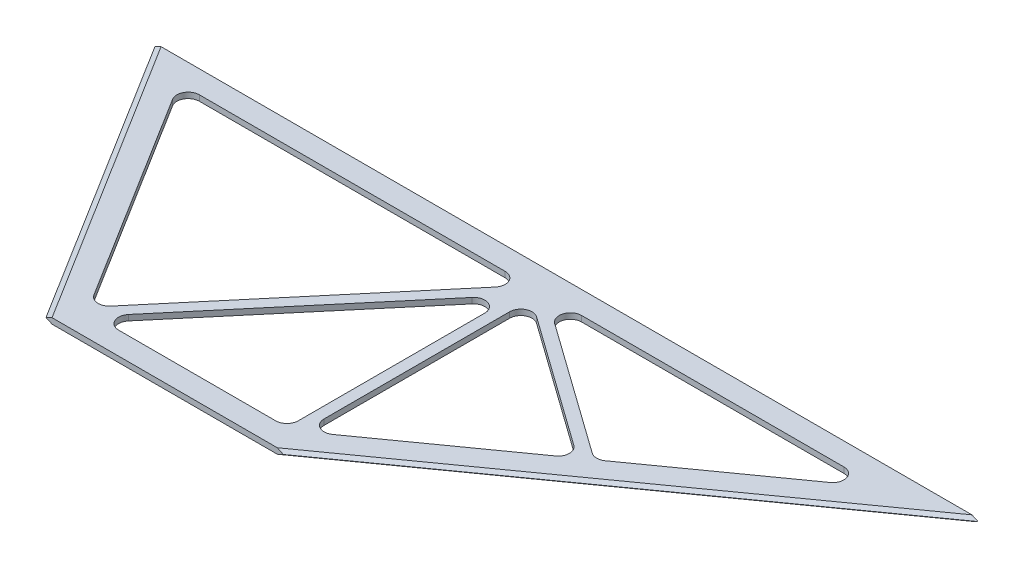
ISO-10303-21;
HEADER;
FILE_DESCRIPTION(('STEP AP214'),'2;1');
FILE_NAME('part.step','',(''),(''),'','','');
FILE_SCHEMA(('AUTOMOTIVE_DESIGN { 1 0 10303 214 1 1 1 1 }'));
ENDSEC;
DATA;
#1=APPLICATION_CONTEXT('core data for automotive mechanical design processes');
#2=APPLICATION_PROTOCOL_DEFINITION('international standard','automotive_design',2000,#1);
#3=PRODUCT_CONTEXT('',#1,'mechanical');
#4=PRODUCT('Part','Part','',(#3));
#5=PRODUCT_RELATED_PRODUCT_CATEGORY('part','',(#4));
#6=PRODUCT_DEFINITION_FORMATION('','',#4);
#7=PRODUCT_DEFINITION_CONTEXT('part definition',#1,'design');
#8=PRODUCT_DEFINITION('design','',#6,#7);
#9=PRODUCT_DEFINITION_SHAPE('','',#8);
#10=(LENGTH_UNIT() NAMED_UNIT(*) SI_UNIT(.MILLI.,.METRE.));
#11=(NAMED_UNIT(*) PLANE_ANGLE_UNIT() SI_UNIT($,.RADIAN.));
#12=(NAMED_UNIT(*) SI_UNIT($,.STERADIAN.) SOLID_ANGLE_UNIT());
#13=UNCERTAINTY_MEASURE_WITH_UNIT(LENGTH_MEASURE(1.E-05),#10,'distance_accuracy_value','');
#14=(GEOMETRIC_REPRESENTATION_CONTEXT(3) GLOBAL_UNCERTAINTY_ASSIGNED_CONTEXT((#13)) GLOBAL_UNIT_ASSIGNED_CONTEXT((#10,
#11,#12)) REPRESENTATION_CONTEXT('',''));
#15=CARTESIAN_POINT('',(0.,0.,0.));
#16=DIRECTION('',(0.,0.,1.));
#17=DIRECTION('',(1.,0.,0.));
#18=AXIS2_PLACEMENT_3D('',#15,#16,#17);
#19=CARTESIAN_POINT('',(-205.723873178313,-1.5875,12.7));
#20=DIRECTION('',(0.,0.,-1.));
#21=DIRECTION('',(-1.,0.,0.));
#22=AXIS2_PLACEMENT_3D('',#19,#20,#21);
#23=PLANE('',#22);
#24=DIRECTION('',(-1.,0.,0.));
#25=VECTOR('',#24,1.);
#26=CARTESIAN_POINT('',(-205.723873178313,1.5875,12.7));
#27=LINE('',#26,#25);
#28=CARTESIAN_POINT('',(-21.8610192780996,1.5875,12.6999999999999));
#29=VERTEX_POINT('',#28);
#30=CARTESIAN_POINT('',(-194.28580976747,1.5875,12.7));
#31=VERTEX_POINT('',#30);
#32=EDGE_CURVE('E431',#29,#31,#27,.T.);
#33=ORIENTED_EDGE('',*,*,#32,.T.);
#34=DIRECTION('',(0.,1.,0.));
#35=VECTOR('',#34,1.);
#36=CARTESIAN_POINT('',(-194.28580976747,-1.5875,12.7));
#37=LINE('',#36,#35);
#38=CARTESIAN_POINT('',(-194.28580976747,-1.5875,12.7));
#39=VERTEX_POINT('',#38);
#40=EDGE_CURVE('E56',#31,#39,#37,.F.);
#41=ORIENTED_EDGE('',*,*,#40,.T.);
#42=DIRECTION('',(-1.,0.,0.));
#43=VECTOR('',#42,1.);
#44=CARTESIAN_POINT('',(-205.723873178313,-1.5875,12.7));
#45=LINE('',#44,#43);
#46=CARTESIAN_POINT('',(-21.8610192780996,-1.5875,12.6999999999999));
#47=VERTEX_POINT('',#46);
#48=EDGE_CURVE('E416',#47,#39,#45,.T.);
#49=ORIENTED_EDGE('',*,*,#48,.F.);
#50=DIRECTION('',(0.,1.,0.));
#51=VECTOR('',#50,1.);
#52=CARTESIAN_POINT('',(-21.8610192780996,-1.5875,12.6999999999999));
#53=LINE('',#52,#51);
#54=EDGE_CURVE('E343',#47,#29,#53,.T.);
#55=ORIENTED_EDGE('',*,*,#54,.T.);
#56=EDGE_LOOP('',(#33,#41,#49,#55));
#57=FACE_BOUND('',#56,.T.);
#58=ADVANCED_FACE('F35',(#57),#23,.F.);
#59=CARTESIAN_POINT('',(188.927034487686,-1.5875,12.6999999999999));
#60=DIRECTION('',(0.580724681627554,0.,0.814100020973207));
#61=DIRECTION('',(0.814100020973207,0.,-0.580724681627554));
#62=AXIS2_PLACEMENT_3D('',#59,#60,#61);
#63=PLANE('',#62);
#64=DIRECTION('',(0.814100020973207,0.,-0.580724681627554));
#65=VECTOR('',#64,1.);
#66=CARTESIAN_POINT('',(188.927034487686,1.5875,12.6999999999999));
#67=LINE('',#66,#65);
#68=CARTESIAN_POINT('',(98.8520279330972,1.5875,76.9535046756063));
#69=VERTEX_POINT('',#68);
#70=CARTESIAN_POINT('',(172.778153459863,1.5875,24.2195351331798));
#71=VERTEX_POINT('',#70);
#72=EDGE_CURVE('E424',#69,#71,#67,.T.);
#73=ORIENTED_EDGE('',*,*,#72,.T.);
#74=DIRECTION('',(0.,1.,0.));
#75=VECTOR('',#74,1.);
#76=CARTESIAN_POINT('',(172.778153459863,-1.5875,24.2195351331798));
#77=LINE('',#76,#75);
#78=CARTESIAN_POINT('',(172.778153459863,-1.5875,24.2195351331798));
#79=VERTEX_POINT('',#78);
#80=EDGE_CURVE('E391',#71,#79,#77,.F.);
#81=ORIENTED_EDGE('',*,*,#80,.T.);
#82=DIRECTION('',(0.814100020973207,0.,-0.580724681627554));
#83=VECTOR('',#82,1.);
#84=CARTESIAN_POINT('',(188.927034487686,-1.5875,12.6999999999999));
#85=LINE('',#84,#83);
#86=CARTESIAN_POINT('',(98.8520279330972,-1.5875,76.9535046756063));
#87=VERTEX_POINT('',#86);
#88=EDGE_CURVE('E407',#87,#79,#85,.T.);
#89=ORIENTED_EDGE('',*,*,#88,.F.);
#90=DIRECTION('',(0.,1.,0.));
#91=VECTOR('',#90,1.);
#92=CARTESIAN_POINT('',(98.8520279330972,-1.5875,76.9535046756063));
#93=LINE('',#92,#91);
#94=EDGE_CURVE('E242',#87,#69,#93,.T.);
#95=ORIENTED_EDGE('',*,*,#94,.T.);
#96=EDGE_LOOP('',(#73,#81,#89,#95));
#97=FACE_BOUND('',#96,.T.);
#98=ADVANCED_FACE('F426',(#97),#63,.F.);
#99=CARTESIAN_POINT('',(-228.6,-1.5875,0.));
#100=DIRECTION('',(0.,0.,-1.));
#101=DIRECTION('',(-1.,0.,0.));
#102=AXIS2_PLACEMENT_3D('',#99,#100,#101);
#103=PLANE('',#102);
#104=DIRECTION('',(-1.,0.,0.));
#105=VECTOR('',#104,1.);
#106=CARTESIAN_POINT('',(-228.6,-1.5875,0.));
#107=LINE('',#106,#105);
#108=CARTESIAN_POINT('',(228.6,-1.5875,0.));
#109=VERTEX_POINT('',#108);
#110=CARTESIAN_POINT('',(-228.6,-1.5875,0.));
#111=VERTEX_POINT('',#110);
#112=EDGE_CURVE('E231',#109,#111,#107,.T.);
#113=ORIENTED_EDGE('',*,*,#112,.T.);
#114=DIRECTION('',(0.906307787036653,-0.422618261740693,0.));
#115=VECTOR('',#114,1.);
#116=CARTESIAN_POINT('',(-232.004404736309,0.,0.));
#117=LINE('',#116,#115);
#118=CARTESIAN_POINT('',(-232.004404736309,0.,0.));
#119=VERTEX_POINT('',#118);
#120=EDGE_CURVE('E275',#119,#111,#117,.T.);
#121=ORIENTED_EDGE('',*,*,#120,.F.);
#122=DIRECTION('',(-0.906307787036653,-0.422618261740693,0.));
#123=VECTOR('',#122,1.);
#124=CARTESIAN_POINT('',(-228.6,1.5875,0.));
#125=LINE('',#124,#123);
#126=CARTESIAN_POINT('',(-228.6,1.5875,0.));
#127=VERTEX_POINT('',#126);
#128=EDGE_CURVE('E272',#127,#119,#125,.T.);
#129=ORIENTED_EDGE('',*,*,#128,.F.);
#130=DIRECTION('',(-1.,0.,0.));
#131=VECTOR('',#130,1.);
#132=CARTESIAN_POINT('',(-228.6,1.5875,0.));
#133=LINE('',#132,#131);
#134=CARTESIAN_POINT('',(228.6,1.5875,0.));
#135=VERTEX_POINT('',#134);
#136=EDGE_CURVE('E291',#135,#127,#133,.T.);
#137=ORIENTED_EDGE('',*,*,#136,.F.);
#138=DIRECTION('',(-0.906307787036649,0.4226182617407,0.));
#139=VECTOR('',#138,1.);
#140=CARTESIAN_POINT('',(228.6,1.5875,0.));
#141=LINE('',#140,#139);
#142=CARTESIAN_POINT('',(232.004404736309,0.,0.));
#143=VERTEX_POINT('',#142);
#144=EDGE_CURVE('E257',#143,#135,#141,.T.);
#145=ORIENTED_EDGE('',*,*,#144,.F.);
#146=DIRECTION('',(0.906307787036649,0.4226182617407,0.));
#147=VECTOR('',#146,1.);
#148=CARTESIAN_POINT('',(232.004404736309,0.,0.));
#149=LINE('',#148,#147);
#150=EDGE_CURVE('E248',#109,#143,#149,.T.);
#151=ORIENTED_EDGE('',*,*,#150,.F.);
#152=EDGE_LOOP('',(#113,#121,#129,#137,#145,#151));
#153=FACE_BOUND('',#152,.T.);
#154=ADVANCED_FACE('F254',(#153),#103,.T.);
#155=CARTESIAN_POINT('',(-127.,-1.5875,163.068));
#156=DIRECTION('',(0.,0.,1.));
#157=DIRECTION('',(1.,0.,0.));
#158=AXIS2_PLACEMENT_3D('',#155,#156,#157);
#159=PLANE('',#158);
#160=DIRECTION('',(1.,0.,0.));
#161=VECTOR('',#160,1.);
#162=CARTESIAN_POINT('',(-127.,-1.5875,163.068));
#163=LINE('',#162,#161);
#164=CARTESIAN_POINT('',(-127.,-1.5875,163.068));
#165=VERTEX_POINT('',#164);
#166=CARTESIAN_POINT('',(0.,-1.5875,163.068));
#167=VERTEX_POINT('',#166);
#168=EDGE_CURVE('E252',#165,#167,#163,.T.);
#169=ORIENTED_EDGE('',*,*,#168,.T.);
#170=DIRECTION('',(0.906307787036649,0.4226182617407,0.));
#171=VECTOR('',#170,1.);
#172=CARTESIAN_POINT('',(3.40440473630894,0.,163.068));
#173=LINE('',#172,#171);
#174=CARTESIAN_POINT('',(3.40440473630894,0.,163.068));
#175=VERTEX_POINT('',#174);
#176=EDGE_CURVE('E251',#167,#175,#173,.T.);
#177=ORIENTED_EDGE('',*,*,#176,.T.);
#178=DIRECTION('',(-0.906307787036649,0.4226182617407,0.));
#179=VECTOR('',#178,1.);
#180=CARTESIAN_POINT('',(0.,1.5875,163.068));
#181=LINE('',#180,#179);
#182=CARTESIAN_POINT('',(0.,1.5875,163.068));
#183=VERTEX_POINT('',#182);
#184=EDGE_CURVE('E258',#175,#183,#181,.T.);
#185=ORIENTED_EDGE('',*,*,#184,.T.);
#186=DIRECTION('',(1.,0.,0.));
#187=VECTOR('',#186,1.);
#188=CARTESIAN_POINT('',(-127.,1.5875,163.068));
#189=LINE('',#188,#187);
#190=CARTESIAN_POINT('',(-127.,1.5875,163.068));
#191=VERTEX_POINT('',#190);
#192=EDGE_CURVE('E287',#191,#183,#189,.T.);
#193=ORIENTED_EDGE('',*,*,#192,.F.);
#194=DIRECTION('',(-0.906307787036653,-0.422618261740693,0.));
#195=VECTOR('',#194,1.);
#196=CARTESIAN_POINT('',(-127.,1.5875,163.068));
#197=LINE('',#196,#195);
#198=CARTESIAN_POINT('',(-130.404404736309,0.,163.068));
#199=VERTEX_POINT('',#198);
#200=EDGE_CURVE('E271',#191,#199,#197,.T.);
#201=ORIENTED_EDGE('',*,*,#200,.T.);
#202=DIRECTION('',(0.906307787036653,-0.422618261740693,0.));
#203=VECTOR('',#202,1.);
#204=CARTESIAN_POINT('',(-130.404404736309,0.,163.068));
#205=LINE('',#204,#203);
#206=EDGE_CURVE('E276',#199,#165,#205,.T.);
#207=ORIENTED_EDGE('',*,*,#206,.T.);
#208=EDGE_LOOP('',(#169,#177,#185,#193,#201,#207));
#209=FACE_BOUND('',#208,.T.);
#210=ADVANCED_FACE('F510',(#209),#159,.T.);
#211=CARTESIAN_POINT('',(0.,-1.5875,0.));
#212=DIRECTION('',(0.,-1.,0.));
#213=DIRECTION('',(0.,0.,-1.));
#214=AXIS2_PLACEMENT_3D('',#211,#212,#213);
#215=PLANE('',#214);
#216=DIRECTION('',(-0.643982857971335,0.,0.765039919637578));
#217=VECTOR('',#216,1.);
#218=CARTESIAN_POINT('',(-8.21559911092268,-1.5875,12.6999999999999));
#219=LINE('',#218,#217);
#220=CARTESIAN_POINT('',(-17.0030157884009,-1.5875,23.1392911481179));
#221=VERTEX_POINT('',#220);
#222=CARTESIAN_POINT('',(-116.087724463673,-1.5875,140.850122459745));
#223=VERTEX_POINT('',#222);
#224=EDGE_CURVE('E470',#221,#223,#219,.T.);
#225=ORIENTED_EDGE('',*,*,#224,.F.);
#226=CARTESIAN_POINT('',(-21.8610192780996,-1.5875,19.0499999999999));
#227=DIRECTION('',(0.,-1.,0.));
#228=DIRECTION('',(0.,0.,-1.));
#229=AXIS2_PLACEMENT_3D('',#226,#227,#228);
#230=CIRCLE('',#229,6.35);
#231=EDGE_CURVE('E378',#221,#47,#230,.F.);
#232=ORIENTED_EDGE('',*,*,#231,.T.);
#233=ORIENTED_EDGE('',*,*,#48,.T.);
#234=CARTESIAN_POINT('',(-194.28580976747,-1.5875,19.05));
#235=DIRECTION('',(0.,-1.,0.));
#236=DIRECTION('',(0.,0.,-1.));
#237=AXIS2_PLACEMENT_3D('',#234,#235,#236);
#238=CIRCLE('',#237,6.35);
#239=CARTESIAN_POINT('',(-199.675309924185,-1.5875,22.4079440228756));
#240=VERTEX_POINT('',#239);
#241=EDGE_CURVE('E11',#39,#240,#238,.F.);
#242=ORIENTED_EDGE('',*,*,#241,.T.);
#243=DIRECTION('',(0.52881008234261,0.,0.848740182159889));
#244=VECTOR('',#243,1.);
#245=CARTESIAN_POINT('',(-119.949418349653,-1.5875,150.368));
#246=LINE('',#245,#244);
#247=CARTESIAN_POINT('',(-126.335228110087,-1.5875,140.118775334503));
#248=VERTEX_POINT('',#247);
#249=EDGE_CURVE('E444',#240,#248,#246,.T.);
#250=ORIENTED_EDGE('',*,*,#249,.T.);
#251=CARTESIAN_POINT('',(-120.945727953372,-1.5875,136.760831311627));
#252=DIRECTION('',(0.,-1.,0.));
#253=DIRECTION('',(0.,0.,-1.));
#254=AXIS2_PLACEMENT_3D('',#251,#252,#253);
#255=CIRCLE('',#254,6.35);
#256=EDGE_CURVE('E353',#248,#223,#255,.F.);
#257=ORIENTED_EDGE('',*,*,#256,.T.);
#258=EDGE_LOOP('',(#225,#232,#233,#242,#250,#257));
#259=FACE_BOUND('',#258,.T.);
#260=DIRECTION('',(0.,0.,-1.));
#261=VECTOR('',#260,1.);
#262=CARTESIAN_POINT('',(-0.890488876800363,-1.5875,148.103166666667));
#263=LINE('',#262,#261);
#264=CARTESIAN_POINT('',(-0.890488876800363,-1.5875,135.773475633941));
#265=VERTEX_POINT('',#264);
#266=CARTESIAN_POINT('',(-0.890488876800363,-1.5875,31.1945365490881));
#267=VERTEX_POINT('',#266);
#268=EDGE_CURVE('E449',#265,#267,#263,.T.);
#269=ORIENTED_EDGE('',*,*,#268,.F.);
#270=CARTESIAN_POINT('',(5.45951112319965,-1.5875,135.773475633941));
#271=DIRECTION('',(0.,-1.,0.));
#272=DIRECTION('',(0.,0.,-1.));
#273=AXIS2_PLACEMENT_3D('',#270,#271,#272);
#274=CIRCLE('',#273,6.35);
#275=CARTESIAN_POINT('',(9.14711285153463,-1.5875,140.943010767121));
#276=VERTEX_POINT('',#275);
#277=EDGE_CURVE('E365',#265,#276,#274,.F.);
#278=ORIENTED_EDGE('',*,*,#277,.T.);
#279=CARTESIAN_POINT('',(82.4501075371792,-1.5875,88.6535412246945));
#280=VERTEX_POINT('',#279);
#281=EDGE_CURVE('E438',#276,#280,#85,.T.);
#282=ORIENTED_EDGE('',*,*,#281,.T.);
#283=CARTESIAN_POINT('',(78.7625058088442,-1.5875,83.4840060915146));
#284=DIRECTION('',(0.,-1.,0.));
#285=DIRECTION('',(0.,0.,-1.));
#286=AXIS2_PLACEMENT_3D('',#283,#284,#285);
#287=CIRCLE('',#286,6.35);
#288=CARTESIAN_POINT('',(82.4501075371792,-1.5875,78.3144709583348));
#289=VERTEX_POINT('',#288);
#290=EDGE_CURVE('E369',#280,#289,#287,.F.);
#291=ORIENTED_EDGE('',*,*,#290,.T.);
#292=DIRECTION('',(0.814100020973207,0.,0.580724681627554));
#293=VECTOR('',#292,1.);
#294=CARTESIAN_POINT('',(-0.890488876800363,-1.5875,18.8648455163627));
#295=LINE('',#294,#293);
#296=CARTESIAN_POINT('',(9.14711285153461,-1.5875,26.0250014159083));
#297=VERTEX_POINT('',#296);
#298=EDGE_CURVE('E476',#297,#289,#295,.T.);
#299=ORIENTED_EDGE('',*,*,#298,.F.);
#300=CARTESIAN_POINT('',(5.45951112319964,-1.5875,31.1945365490881));
#301=DIRECTION('',(0.,-1.,0.));
#302=DIRECTION('',(0.,0.,-1.));
#303=AXIS2_PLACEMENT_3D('',#300,#301,#302);
#304=CIRCLE('',#303,6.35);
#305=EDGE_CURVE('E386',#297,#267,#304,.F.);
#306=ORIENTED_EDGE('',*,*,#305,.T.);
#307=EDGE_LOOP('',(#269,#278,#282,#291,#299,#306));
#308=FACE_BOUND('',#307,.T.);
#309=DIRECTION('',(-0.814100020973206,0.,-0.580724681627555));
#310=VECTOR('',#309,1.);
#311=CARTESIAN_POINT('',(1.40181792183905,-1.5875,12.6999999999999));
#312=LINE('',#311,#310);
#313=CARTESIAN_POINT('',(91.4768244764273,-1.5875,76.9535046756063));
#314=VERTEX_POINT('',#313);
#315=CARTESIAN_POINT('',(17.5506989496612,-1.5875,24.2195351331798));
#316=VERTEX_POINT('',#315);
#317=EDGE_CURVE('E473',#314,#316,#312,.T.);
#318=ORIENTED_EDGE('',*,*,#317,.F.);
#319=CARTESIAN_POINT('',(95.1644262047623,-1.5875,71.7839695424264));
#320=DIRECTION('',(0.,-1.,0.));
#321=DIRECTION('',(0.,0.,-1.));
#322=AXIS2_PLACEMENT_3D('',#319,#320,#321);
#323=CIRCLE('',#322,6.35);
#324=EDGE_CURVE('E348',#314,#87,#323,.F.);
#325=ORIENTED_EDGE('',*,*,#324,.T.);
#326=ORIENTED_EDGE('',*,*,#88,.T.);
#327=CARTESIAN_POINT('',(169.090551731528,-1.5875,19.0499999999999));
#328=DIRECTION('',(0.,-1.,0.));
#329=DIRECTION('',(0.,0.,-1.));
#330=AXIS2_PLACEMENT_3D('',#327,#328,#329);
#331=CIRCLE('',#330,6.35);
#332=CARTESIAN_POINT('',(169.090551731528,-1.5875,12.6999999999999));
#333=VERTEX_POINT('',#332);
#334=EDGE_CURVE('E399',#79,#333,#331,.F.);
#335=ORIENTED_EDGE('',*,*,#334,.T.);
#336=CARTESIAN_POINT('',(21.2383006779962,-1.5875,12.6999999999999));
#337=VERTEX_POINT('',#336);
#338=EDGE_CURVE('E268',#333,#337,#45,.T.);
#339=ORIENTED_EDGE('',*,*,#338,.T.);
#340=CARTESIAN_POINT('',(21.2383006779962,-1.5875,19.0499999999999));
#341=DIRECTION('',(0.,-1.,0.));
#342=DIRECTION('',(0.,0.,-1.));
#343=AXIS2_PLACEMENT_3D('',#340,#341,#342);
#344=CIRCLE('',#343,6.35);
#345=EDGE_CURVE('E374',#337,#316,#344,.F.);
#346=ORIENTED_EDGE('',*,*,#345,.T.);
#347=EDGE_LOOP('',(#318,#325,#326,#335,#339,#346));
#348=FACE_BOUND('',#347,.T.);
#349=DIRECTION('',(0.643982857971335,0.,-0.765039919637578));
#350=VECTOR('',#349,1.);
#351=CARTESIAN_POINT('',(-7.24048887680036,-1.5875,21.4020976963624));
#352=LINE('',#351,#350);
#353=CARTESIAN_POINT('',(-107.011891438052,-1.5875,139.928708851882));
#354=VERTEX_POINT('',#353);
#355=CARTESIAN_POINT('',(-18.448492366499,-1.5875,34.7170019409695));
#356=VERTEX_POINT('',#355);
#357=EDGE_CURVE('E467',#354,#356,#352,.T.);
#358=ORIENTED_EDGE('',*,*,#357,.F.);
#359=CARTESIAN_POINT('',(-102.153887948354,-1.5875,144.018));
#360=DIRECTION('',(0.,-1.,0.));
#361=DIRECTION('',(0.,0.,-1.));
#362=AXIS2_PLACEMENT_3D('',#359,#360,#361);
#363=CIRCLE('',#362,6.35);
#364=CARTESIAN_POINT('',(-102.153887948354,-1.5875,150.368));
#365=VERTEX_POINT('',#364);
#366=EDGE_CURVE('E357',#354,#365,#363,.F.);
#367=ORIENTED_EDGE('',*,*,#366,.T.);
#368=DIRECTION('',(1.,0.,0.));
#369=VECTOR('',#368,1.);
#370=CARTESIAN_POINT('',(-4.06548887680036,-1.5875,150.368));
#371=LINE('',#370,#369);
#372=CARTESIAN_POINT('',(-13.5904888768004,-1.5875,150.368));
#373=VERTEX_POINT('',#372);
#374=EDGE_CURVE('E441',#365,#373,#371,.T.);
#375=ORIENTED_EDGE('',*,*,#374,.T.);
#376=CARTESIAN_POINT('',(-13.5904888768004,-1.5875,144.018));
#377=DIRECTION('',(0.,-1.,0.));
#378=DIRECTION('',(0.,0.,-1.));
#379=AXIS2_PLACEMENT_3D('',#376,#377,#378);
#380=CIRCLE('',#379,6.35);
#381=CARTESIAN_POINT('',(-7.24048887680036,-1.5875,144.018));
#382=VERTEX_POINT('',#381);
#383=EDGE_CURVE('E361',#373,#382,#380,.F.);
#384=ORIENTED_EDGE('',*,*,#383,.T.);
#385=DIRECTION('',(0.,0.,1.));
#386=VECTOR('',#385,1.);
#387=CARTESIAN_POINT('',(-7.24048887680036,-1.5875,150.368));
#388=LINE('',#387,#386);
#389=CARTESIAN_POINT('',(-7.24048887680036,-1.5875,38.8062930890875));
#390=VERTEX_POINT('',#389);
#391=EDGE_CURVE('E436',#390,#382,#388,.T.);
#392=ORIENTED_EDGE('',*,*,#391,.F.);
#393=CARTESIAN_POINT('',(-13.5904888768004,-1.5875,38.8062930890875));
#394=DIRECTION('',(0.,-1.,0.));
#395=DIRECTION('',(0.,0.,-1.));
#396=AXIS2_PLACEMENT_3D('',#393,#394,#395);
#397=CIRCLE('',#396,6.35);
#398=EDGE_CURVE('E382',#390,#356,#397,.F.);
#399=ORIENTED_EDGE('',*,*,#398,.T.);
#400=EDGE_LOOP('',(#358,#367,#375,#384,#392,#399));
#401=FACE_BOUND('',#400,.T.);
#402=DIRECTION('',(0.52881008234261,0.,0.848740182159889));
#403=VECTOR('',#402,1.);
#404=CARTESIAN_POINT('',(-127.,-1.5875,163.068));
#405=LINE('',#404,#403);
#406=EDGE_CURVE('E237',#111,#165,#405,.T.);
#407=ORIENTED_EDGE('',*,*,#406,.F.);
#408=ORIENTED_EDGE('',*,*,#112,.F.);
#409=DIRECTION('',(0.814100020973207,0.,-0.580724681627554));
#410=VECTOR('',#409,1.);
#411=CARTESIAN_POINT('',(0.,-1.5875,163.068));
#412=LINE('',#411,#410);
#413=EDGE_CURVE('E234',#167,#109,#412,.T.);
#414=ORIENTED_EDGE('',*,*,#413,.F.);
#415=ORIENTED_EDGE('',*,*,#168,.F.);
#416=EDGE_LOOP('',(#407,#408,#414,#415));
#417=FACE_BOUND('',#416,.T.);
#418=ADVANCED_FACE('F233',(#259,#308,#348,#401,#417),#215,.T.);
#419=CARTESIAN_POINT('',(0.,1.5875,0.));
#420=DIRECTION('',(0.,-1.,0.));
#421=DIRECTION('',(0.,0.,-1.));
#422=AXIS2_PLACEMENT_3D('',#419,#420,#421);
#423=PLANE('',#422);
#424=ORIENTED_EDGE('',*,*,#32,.F.);
#425=CARTESIAN_POINT('',(-21.8610192780996,1.5875,19.0499999999999));
#426=DIRECTION('',(0.,-1.,0.));
#427=DIRECTION('',(0.,0.,-1.));
#428=AXIS2_PLACEMENT_3D('',#425,#426,#427);
#429=CIRCLE('',#428,6.35);
#430=CARTESIAN_POINT('',(-17.0030157884009,1.5875,23.1392911481179));
#431=VERTEX_POINT('',#430);
#432=EDGE_CURVE('E376',#29,#431,#429,.T.);
#433=ORIENTED_EDGE('',*,*,#432,.T.);
#434=DIRECTION('',(-0.643982857971335,0.,0.765039919637578));
#435=VECTOR('',#434,1.);
#436=CARTESIAN_POINT('',(-8.21559911092268,1.5875,12.6999999999999));
#437=LINE('',#436,#435);
#438=CARTESIAN_POINT('',(-116.087724463673,1.5875,140.850122459745));
#439=VERTEX_POINT('',#438);
#440=EDGE_CURVE('E453',#431,#439,#437,.T.);
#441=ORIENTED_EDGE('',*,*,#440,.T.);
#442=CARTESIAN_POINT('',(-120.945727953372,1.5875,136.760831311627));
#443=DIRECTION('',(0.,-1.,0.));
#444=DIRECTION('',(0.,0.,-1.));
#445=AXIS2_PLACEMENT_3D('',#442,#443,#444);
#446=CIRCLE('',#445,6.35);
#447=CARTESIAN_POINT('',(-126.335228110087,1.5875,140.118775334503));
#448=VERTEX_POINT('',#447);
#449=EDGE_CURVE('E350',#439,#448,#446,.T.);
#450=ORIENTED_EDGE('',*,*,#449,.T.);
#451=DIRECTION('',(0.52881008234261,0.,0.848740182159889));
#452=VECTOR('',#451,1.);
#453=CARTESIAN_POINT('',(-119.949418349653,1.5875,150.368));
#454=LINE('',#453,#452);
#455=CARTESIAN_POINT('',(-199.675309924185,1.5875,22.4079440228756));
#456=VERTEX_POINT('',#455);
#457=EDGE_CURVE('E433',#456,#448,#454,.T.);
#458=ORIENTED_EDGE('',*,*,#457,.F.);
#459=CARTESIAN_POINT('',(-194.28580976747,1.5875,19.05));
#460=DIRECTION('',(0.,-1.,0.));
#461=DIRECTION('',(0.,0.,-1.));
#462=AXIS2_PLACEMENT_3D('',#459,#460,#461);
#463=CIRCLE('',#462,6.35);
#464=EDGE_CURVE('E43',#456,#31,#463,.T.);
#465=ORIENTED_EDGE('',*,*,#464,.T.);
#466=EDGE_LOOP('',(#424,#433,#441,#450,#458,#465));
#467=FACE_BOUND('',#466,.T.);
#468=CARTESIAN_POINT('',(9.14711285153463,1.5875,140.943010767121));
#469=VERTEX_POINT('',#468);
#470=CARTESIAN_POINT('',(82.4501075371792,1.5875,88.6535412246945));
#471=VERTEX_POINT('',#470);
#472=EDGE_CURVE('E428',#469,#471,#67,.T.);
#473=ORIENTED_EDGE('',*,*,#472,.F.);
#474=CARTESIAN_POINT('',(5.45951112319965,1.5875,135.773475633941));
#475=DIRECTION('',(0.,-1.,0.));
#476=DIRECTION('',(0.,0.,-1.));
#477=AXIS2_PLACEMENT_3D('',#474,#475,#476);
#478=CIRCLE('',#477,6.35);
#479=CARTESIAN_POINT('',(-0.890488876800363,1.5875,135.773475633941));
#480=VERTEX_POINT('',#479);
#481=EDGE_CURVE('E363',#469,#480,#478,.T.);
#482=ORIENTED_EDGE('',*,*,#481,.T.);
#483=DIRECTION('',(0.,0.,-1.));
#484=VECTOR('',#483,1.);
#485=CARTESIAN_POINT('',(-0.890488876800363,1.5875,148.103166666667));
#486=LINE('',#485,#484);
#487=CARTESIAN_POINT('',(-0.890488876800363,1.5875,31.1945365490881));
#488=VERTEX_POINT('',#487);
#489=EDGE_CURVE('E462',#480,#488,#486,.T.);
#490=ORIENTED_EDGE('',*,*,#489,.T.);
#491=CARTESIAN_POINT('',(5.45951112319964,1.5875,31.1945365490881));
#492=DIRECTION('',(0.,-1.,0.));
#493=DIRECTION('',(0.,0.,-1.));
#494=AXIS2_PLACEMENT_3D('',#491,#492,#493);
#495=CIRCLE('',#494,6.35);
#496=CARTESIAN_POINT('',(9.14711285153461,1.5875,26.0250014159083));
#497=VERTEX_POINT('',#496);
#498=EDGE_CURVE('E384',#488,#497,#495,.T.);
#499=ORIENTED_EDGE('',*,*,#498,.T.);
#500=DIRECTION('',(0.814100020973207,0.,0.580724681627554));
#501=VECTOR('',#500,1.);
#502=CARTESIAN_POINT('',(-0.890488876800363,1.5875,18.8648455163627));
#503=LINE('',#502,#501);
#504=CARTESIAN_POINT('',(82.4501075371792,1.5875,78.3144709583348));
#505=VERTEX_POINT('',#504);
#506=EDGE_CURVE('E459',#497,#505,#503,.T.);
#507=ORIENTED_EDGE('',*,*,#506,.T.);
#508=CARTESIAN_POINT('',(78.7625058088442,1.5875,83.4840060915146));
#509=DIRECTION('',(0.,-1.,0.));
#510=DIRECTION('',(0.,0.,-1.));
#511=AXIS2_PLACEMENT_3D('',#508,#509,#510);
#512=CIRCLE('',#511,6.35);
#513=EDGE_CURVE('E367',#505,#471,#512,.T.);
#514=ORIENTED_EDGE('',*,*,#513,.T.);
#515=EDGE_LOOP('',(#473,#482,#490,#499,#507,#514));
#516=FACE_BOUND('',#515,.T.);
#517=ORIENTED_EDGE('',*,*,#72,.F.);
#518=CARTESIAN_POINT('',(95.1644262047623,1.5875,71.7839695424264));
#519=DIRECTION('',(0.,-1.,0.));
#520=DIRECTION('',(0.,0.,-1.));
#521=AXIS2_PLACEMENT_3D('',#518,#519,#520);
#522=CIRCLE('',#521,6.35);
#523=CARTESIAN_POINT('',(91.4768244764273,1.5875,76.9535046756063));
#524=VERTEX_POINT('',#523);
#525=EDGE_CURVE('E346',#69,#524,#522,.T.);
#526=ORIENTED_EDGE('',*,*,#525,.T.);
#527=DIRECTION('',(-0.814100020973206,0.,-0.580724681627555));
#528=VECTOR('',#527,1.);
#529=CARTESIAN_POINT('',(1.40181792183905,1.5875,12.6999999999999));
#530=LINE('',#529,#528);
#531=CARTESIAN_POINT('',(17.5506989496612,1.5875,24.2195351331798));
#532=VERTEX_POINT('',#531);
#533=EDGE_CURVE('E456',#524,#532,#530,.T.);
#534=ORIENTED_EDGE('',*,*,#533,.T.);
#535=CARTESIAN_POINT('',(21.2383006779962,1.5875,19.0499999999999));
#536=DIRECTION('',(0.,-1.,0.));
#537=DIRECTION('',(0.,0.,-1.));
#538=AXIS2_PLACEMENT_3D('',#535,#536,#537);
#539=CIRCLE('',#538,6.35);
#540=CARTESIAN_POINT('',(21.2383006779962,1.5875,12.6999999999999));
#541=VERTEX_POINT('',#540);
#542=EDGE_CURVE('E371',#532,#541,#539,.T.);
#543=ORIENTED_EDGE('',*,*,#542,.T.);
#544=CARTESIAN_POINT('',(169.090551731528,1.5875,12.6999999999999));
#545=VERTEX_POINT('',#544);
#546=EDGE_CURVE('E265',#545,#541,#27,.T.);
#547=ORIENTED_EDGE('',*,*,#546,.F.);
#548=CARTESIAN_POINT('',(169.090551731528,1.5875,19.0499999999999));
#549=DIRECTION('',(0.,-1.,0.));
#550=DIRECTION('',(0.,0.,-1.));
#551=AXIS2_PLACEMENT_3D('',#548,#549,#550);
#552=CIRCLE('',#551,6.35);
#553=EDGE_CURVE('E397',#545,#71,#552,.T.);
#554=ORIENTED_EDGE('',*,*,#553,.T.);
#555=EDGE_LOOP('',(#517,#526,#534,#543,#547,#554));
#556=FACE_BOUND('',#555,.T.);
#557=DIRECTION('',(1.,0.,0.));
#558=VECTOR('',#557,1.);
#559=CARTESIAN_POINT('',(-4.06548887680036,1.5875,150.368));
#560=LINE('',#559,#558);
#561=CARTESIAN_POINT('',(-102.153887948354,1.5875,150.368));
#562=VERTEX_POINT('',#561);
#563=CARTESIAN_POINT('',(-13.5904888768004,1.5875,150.368));
#564=VERTEX_POINT('',#563);
#565=EDGE_CURVE('E429',#562,#564,#560,.T.);
#566=ORIENTED_EDGE('',*,*,#565,.F.);
#567=CARTESIAN_POINT('',(-102.153887948354,1.5875,144.018));
#568=DIRECTION('',(0.,-1.,0.));
#569=DIRECTION('',(0.,0.,-1.));
#570=AXIS2_PLACEMENT_3D('',#567,#568,#569);
#571=CIRCLE('',#570,6.35);
#572=CARTESIAN_POINT('',(-107.011891438052,1.5875,139.928708851882));
#573=VERTEX_POINT('',#572);
#574=EDGE_CURVE('E355',#562,#573,#571,.T.);
#575=ORIENTED_EDGE('',*,*,#574,.T.);
#576=DIRECTION('',(0.643982857971335,0.,-0.765039919637578));
#577=VECTOR('',#576,1.);
#578=CARTESIAN_POINT('',(-7.24048887680036,1.5875,21.4020976963624));
#579=LINE('',#578,#577);
#580=CARTESIAN_POINT('',(-18.448492366499,1.5875,34.7170019409695));
#581=VERTEX_POINT('',#580);
#582=EDGE_CURVE('E450',#573,#581,#579,.T.);
#583=ORIENTED_EDGE('',*,*,#582,.T.);
#584=CARTESIAN_POINT('',(-13.5904888768004,1.5875,38.8062930890875));
#585=DIRECTION('',(0.,-1.,0.));
#586=DIRECTION('',(0.,0.,-1.));
#587=AXIS2_PLACEMENT_3D('',#584,#585,#586);
#588=CIRCLE('',#587,6.35);
#589=CARTESIAN_POINT('',(-7.24048887680036,1.5875,38.8062930890875));
#590=VERTEX_POINT('',#589);
#591=EDGE_CURVE('E380',#581,#590,#588,.T.);
#592=ORIENTED_EDGE('',*,*,#591,.T.);
#593=DIRECTION('',(0.,0.,1.));
#594=VECTOR('',#593,1.);
#595=CARTESIAN_POINT('',(-7.24048887680036,1.5875,150.368));
#596=LINE('',#595,#594);
#597=CARTESIAN_POINT('',(-7.24048887680036,1.5875,144.018));
#598=VERTEX_POINT('',#597);
#599=EDGE_CURVE('E446',#590,#598,#596,.T.);
#600=ORIENTED_EDGE('',*,*,#599,.T.);
#601=CARTESIAN_POINT('',(-13.5904888768004,1.5875,144.018));
#602=DIRECTION('',(0.,-1.,0.));
#603=DIRECTION('',(0.,0.,-1.));
#604=AXIS2_PLACEMENT_3D('',#601,#602,#603);
#605=CIRCLE('',#604,6.35);
#606=EDGE_CURVE('E359',#598,#564,#605,.T.);
#607=ORIENTED_EDGE('',*,*,#606,.T.);
#608=EDGE_LOOP('',(#566,#575,#583,#592,#600,#607));
#609=FACE_BOUND('',#608,.T.);
#610=DIRECTION('',(0.52881008234261,0.,0.848740182159889));
#611=VECTOR('',#610,1.);
#612=CARTESIAN_POINT('',(-127.,1.5875,163.068));
#613=LINE('',#612,#611);
#614=EDGE_CURVE('E284',#127,#191,#613,.T.);
#615=ORIENTED_EDGE('',*,*,#614,.T.);
#616=ORIENTED_EDGE('',*,*,#192,.T.);
#617=DIRECTION('',(0.814100020973207,0.,-0.580724681627554));
#618=VECTOR('',#617,1.);
#619=CARTESIAN_POINT('',(0.,1.5875,163.068));
#620=LINE('',#619,#618);
#621=EDGE_CURVE('E289',#183,#135,#620,.T.);
#622=ORIENTED_EDGE('',*,*,#621,.T.);
#623=ORIENTED_EDGE('',*,*,#136,.T.);
#624=EDGE_LOOP('',(#615,#616,#622,#623));
#625=FACE_BOUND('',#624,.T.);
#626=ADVANCED_FACE('F422',(#467,#516,#556,#609,#625),#423,.F.);
#627=CARTESIAN_POINT('',(-232.004404736309,0.,0.));
#628=DIRECTION('',(-0.408687698312489,-0.876433597358272,0.254634079945476));
#629=DIRECTION('',(0.906307787036653,-0.422618261740693,0.));
#630=AXIS2_PLACEMENT_3D('',#627,#628,#629);
#631=PLANE('',#630);
#632=ORIENTED_EDGE('',*,*,#206,.F.);
#633=DIRECTION('',(0.52881008234261,0.,0.848740182159889));
#634=VECTOR('',#633,1.);
#635=CARTESIAN_POINT('',(-232.004404736309,0.,0.));
#636=LINE('',#635,#634);
#637=EDGE_CURVE('E278',#119,#199,#636,.T.);
#638=ORIENTED_EDGE('',*,*,#637,.F.);
#639=ORIENTED_EDGE('',*,*,#120,.T.);
#640=ORIENTED_EDGE('',*,*,#406,.T.);
#641=EDGE_LOOP('',(#632,#638,#639,#640));
#642=FACE_BOUND('',#641,.T.);
#643=ADVANCED_FACE('F517',(#642),#631,.T.);
#644=CARTESIAN_POINT('',(-228.6,1.5875,0.));
#645=DIRECTION('',(-0.408687698312489,0.876433597358272,0.254634079945476));
#646=DIRECTION('',(-0.906307787036653,-0.422618261740693,0.));
#647=AXIS2_PLACEMENT_3D('',#644,#645,#646);
#648=PLANE('',#647);
#649=ORIENTED_EDGE('',*,*,#200,.F.);
#650=ORIENTED_EDGE('',*,*,#614,.F.);
#651=ORIENTED_EDGE('',*,*,#128,.T.);
#652=ORIENTED_EDGE('',*,*,#637,.T.);
#653=EDGE_LOOP('',(#649,#650,#651,#652));
#654=FACE_BOUND('',#653,.T.);
#655=ADVANCED_FACE('F548',(#654),#648,.T.);
#656=CARTESIAN_POINT('',(228.6,1.5875,0.));
#657=DIRECTION('',(0.363596771107805,0.779735791915616,0.509715099683839));
#658=DIRECTION('',(0.,-0.547165025730721,0.837024751496095));
#659=AXIS2_PLACEMENT_3D('',#656,#657,#658);
#660=PLANE('',#659);
#661=ORIENTED_EDGE('',*,*,#184,.F.);
#662=DIRECTION('',(-0.814100020973207,0.,0.580724681627554));
#663=VECTOR('',#662,1.);
#664=CARTESIAN_POINT('',(232.004404736309,0.,0.));
#665=LINE('',#664,#663);
#666=EDGE_CURVE('E260',#143,#175,#665,.T.);
#667=ORIENTED_EDGE('',*,*,#666,.F.);
#668=ORIENTED_EDGE('',*,*,#144,.T.);
#669=ORIENTED_EDGE('',*,*,#621,.F.);
#670=EDGE_LOOP('',(#661,#667,#668,#669));
#671=FACE_BOUND('',#670,.T.);
#672=ADVANCED_FACE('F542',(#671),#660,.T.);
#673=CARTESIAN_POINT('',(232.004404736309,0.,0.));
#674=DIRECTION('',(0.363596771107805,-0.779735791915616,0.509715099683839));
#675=DIRECTION('',(0.,-0.547165025730721,-0.837024751496095));
#676=AXIS2_PLACEMENT_3D('',#673,#674,#675);
#677=PLANE('',#676);
#678=ORIENTED_EDGE('',*,*,#176,.F.);
#679=ORIENTED_EDGE('',*,*,#413,.T.);
#680=ORIENTED_EDGE('',*,*,#150,.T.);
#681=ORIENTED_EDGE('',*,*,#666,.T.);
#682=EDGE_LOOP('',(#678,#679,#680,#681));
#683=FACE_BOUND('',#682,.T.);
#684=ADVANCED_FACE('F247',(#683),#677,.T.);
#685=CARTESIAN_POINT('',(-119.949418349653,-1.5875,150.368));
#686=DIRECTION('',(-0.848740182159889,0.,0.52881008234261));
#687=DIRECTION('',(0.528810082342611,0.,0.848740182159889));
#688=AXIS2_PLACEMENT_3D('',#685,#686,#687);
#689=PLANE('',#688);
#690=ORIENTED_EDGE('',*,*,#249,.F.);
#691=DIRECTION('',(0.,1.,0.));
#692=VECTOR('',#691,1.);
#693=CARTESIAN_POINT('',(-199.675309924185,1.5875,22.4079440228755));
#694=LINE('',#693,#692);
#695=EDGE_CURVE('E393',#240,#456,#694,.T.);
#696=ORIENTED_EDGE('',*,*,#695,.T.);
#697=ORIENTED_EDGE('',*,*,#457,.T.);
#698=DIRECTION('',(0.,1.,0.));
#699=VECTOR('',#698,1.);
#700=CARTESIAN_POINT('',(-126.335228110087,-1.5875,140.118775334503));
#701=LINE('',#700,#699);
#702=EDGE_CURVE('E307',#448,#248,#701,.F.);
#703=ORIENTED_EDGE('',*,*,#702,.T.);
#704=EDGE_LOOP('',(#690,#696,#697,#703));
#705=FACE_BOUND('',#704,.T.);
#706=ADVANCED_FACE('F531',(#705),#689,.F.);
#707=ORIENTED_EDGE('',*,*,#338,.F.);
#708=DIRECTION('',(0.,1.,0.));
#709=VECTOR('',#708,1.);
#710=CARTESIAN_POINT('',(169.090551731528,1.5875,12.6999999999999));
#711=LINE('',#710,#709);
#712=EDGE_CURVE('E388',#333,#545,#711,.T.);
#713=ORIENTED_EDGE('',*,*,#712,.T.);
#714=ORIENTED_EDGE('',*,*,#546,.T.);
#715=DIRECTION('',(0.,1.,0.));
#716=VECTOR('',#715,1.);
#717=CARTESIAN_POINT('',(21.2383006779962,-1.5875,12.6999999999999));
#718=LINE('',#717,#716);
#719=EDGE_CURVE('E340',#541,#337,#718,.F.);
#720=ORIENTED_EDGE('',*,*,#719,.T.);
#721=EDGE_LOOP('',(#707,#713,#714,#720));
#722=FACE_BOUND('',#721,.T.);
#723=ADVANCED_FACE('F412',(#722),#23,.F.);
#724=ORIENTED_EDGE('',*,*,#281,.F.);
#725=DIRECTION('',(0.,1.,0.));
#726=VECTOR('',#725,1.);
#727=CARTESIAN_POINT('',(9.14711285153463,-1.5875,140.943010767121));
#728=LINE('',#727,#726);
#729=EDGE_CURVE('E327',#276,#469,#728,.T.);
#730=ORIENTED_EDGE('',*,*,#729,.T.);
#731=ORIENTED_EDGE('',*,*,#472,.T.);
#732=DIRECTION('',(0.,1.,0.));
#733=VECTOR('',#732,1.);
#734=CARTESIAN_POINT('',(82.4501075371792,-1.5875,88.6535412246945));
#735=LINE('',#734,#733);
#736=EDGE_CURVE('E325',#471,#280,#735,.F.);
#737=ORIENTED_EDGE('',*,*,#736,.T.);
#738=EDGE_LOOP('',(#724,#730,#731,#737));
#739=FACE_BOUND('',#738,.T.);
#740=ADVANCED_FACE('F505',(#739),#63,.F.);
#741=CARTESIAN_POINT('',(-4.06548887680036,-1.5875,150.368));
#742=DIRECTION('',(0.,0.,1.));
#743=DIRECTION('',(1.,0.,0.));
#744=AXIS2_PLACEMENT_3D('',#741,#742,#743);
#745=PLANE('',#744);
#746=ORIENTED_EDGE('',*,*,#374,.F.);
#747=DIRECTION('',(0.,1.,0.));
#748=VECTOR('',#747,1.);
#749=CARTESIAN_POINT('',(-102.153887948354,-1.5875,150.368));
#750=LINE('',#749,#748);
#751=EDGE_CURVE('E312',#365,#562,#750,.T.);
#752=ORIENTED_EDGE('',*,*,#751,.T.);
#753=ORIENTED_EDGE('',*,*,#565,.T.);
#754=DIRECTION('',(0.,1.,0.));
#755=VECTOR('',#754,1.);
#756=CARTESIAN_POINT('',(-13.5904888768004,-1.5875,150.368));
#757=LINE('',#756,#755);
#758=EDGE_CURVE('E310',#564,#373,#757,.F.);
#759=ORIENTED_EDGE('',*,*,#758,.T.);
#760=EDGE_LOOP('',(#746,#752,#753,#759));
#761=FACE_BOUND('',#760,.T.);
#762=ADVANCED_FACE('F536',(#761),#745,.F.);
#763=CARTESIAN_POINT('',(-7.24048887680036,-1.5875,150.368));
#764=DIRECTION('',(-1.,0.,0.));
#765=DIRECTION('',(0.,0.,1.));
#766=AXIS2_PLACEMENT_3D('',#763,#764,#765);
#767=PLANE('',#766);
#768=ORIENTED_EDGE('',*,*,#391,.T.);
#769=DIRECTION('',(0.,1.,0.));
#770=VECTOR('',#769,1.);
#771=CARTESIAN_POINT('',(-7.24048887680036,-1.5875,144.018));
#772=LINE('',#771,#770);
#773=EDGE_CURVE('E322',#382,#598,#772,.T.);
#774=ORIENTED_EDGE('',*,*,#773,.T.);
#775=ORIENTED_EDGE('',*,*,#599,.F.);
#776=DIRECTION('',(0.,1.,0.));
#777=VECTOR('',#776,1.);
#778=CARTESIAN_POINT('',(-7.24048887680036,-1.5875,38.8062930890875));
#779=LINE('',#778,#777);
#780=EDGE_CURVE('E320',#590,#390,#779,.F.);
#781=ORIENTED_EDGE('',*,*,#780,.T.);
#782=EDGE_LOOP('',(#768,#774,#775,#781));
#783=FACE_BOUND('',#782,.T.);
#784=ADVANCED_FACE('F594',(#783),#767,.T.);
#785=CARTESIAN_POINT('',(-7.24048887680036,-1.5875,21.4020976963624));
#786=DIRECTION('',(0.765039919637578,0.,0.643982857971335));
#787=DIRECTION('',(0.643982857971335,0.,-0.765039919637578));
#788=AXIS2_PLACEMENT_3D('',#785,#786,#787);
#789=PLANE('',#788);
#790=ORIENTED_EDGE('',*,*,#582,.F.);
#791=DIRECTION('',(0.,1.,0.));
#792=VECTOR('',#791,1.);
#793=CARTESIAN_POINT('',(-107.011891438052,-1.5875,139.928708851882));
#794=LINE('',#793,#792);
#795=EDGE_CURVE('E318',#573,#354,#794,.F.);
#796=ORIENTED_EDGE('',*,*,#795,.T.);
#797=ORIENTED_EDGE('',*,*,#357,.T.);
#798=DIRECTION('',(0.,1.,0.));
#799=VECTOR('',#798,1.);
#800=CARTESIAN_POINT('',(-18.448492366499,1.5875,34.7170019409695));
#801=LINE('',#800,#799);
#802=EDGE_CURVE('E315',#356,#581,#801,.T.);
#803=ORIENTED_EDGE('',*,*,#802,.T.);
#804=EDGE_LOOP('',(#790,#796,#797,#803));
#805=FACE_BOUND('',#804,.T.);
#806=ADVANCED_FACE('F604',(#805),#789,.T.);
#807=CARTESIAN_POINT('',(-8.21559911092268,-1.5875,12.6999999999999));
#808=DIRECTION('',(-0.765039919637578,0.,-0.643982857971335));
#809=DIRECTION('',(-0.643982857971335,0.,0.765039919637578));
#810=AXIS2_PLACEMENT_3D('',#807,#808,#809);
#811=PLANE('',#810);
#812=ORIENTED_EDGE('',*,*,#224,.T.);
#813=DIRECTION('',(0.,1.,0.));
#814=VECTOR('',#813,1.);
#815=CARTESIAN_POINT('',(-116.087724463673,-1.5875,140.850122459745));
#816=LINE('',#815,#814);
#817=EDGE_CURVE('E304',#223,#439,#816,.T.);
#818=ORIENTED_EDGE('',*,*,#817,.T.);
#819=ORIENTED_EDGE('',*,*,#440,.F.);
#820=DIRECTION('',(0.,1.,0.));
#821=VECTOR('',#820,1.);
#822=CARTESIAN_POINT('',(-17.0030157884009,-1.5875,23.1392911481179));
#823=LINE('',#822,#821);
#824=EDGE_CURVE('E302',#431,#221,#823,.F.);
#825=ORIENTED_EDGE('',*,*,#824,.T.);
#826=EDGE_LOOP('',(#812,#818,#819,#825));
#827=FACE_BOUND('',#826,.T.);
#828=ADVANCED_FACE('F615',(#827),#811,.T.);
#829=CARTESIAN_POINT('',(1.40181792183905,-1.5875,12.6999999999999));
#830=DIRECTION('',(0.580724681627555,0.,-0.814100020973207));
#831=DIRECTION('',(-0.814100020973207,0.,-0.580724681627555));
#832=AXIS2_PLACEMENT_3D('',#829,#830,#831);
#833=PLANE('',#832);
#834=ORIENTED_EDGE('',*,*,#533,.F.);
#835=DIRECTION('',(0.,1.,0.));
#836=VECTOR('',#835,1.);
#837=CARTESIAN_POINT('',(91.4768244764273,-1.5875,76.9535046756063));
#838=LINE('',#837,#836);
#839=EDGE_CURVE('E300',#524,#314,#838,.F.);
#840=ORIENTED_EDGE('',*,*,#839,.T.);
#841=ORIENTED_EDGE('',*,*,#317,.T.);
#842=DIRECTION('',(0.,1.,0.));
#843=VECTOR('',#842,1.);
#844=CARTESIAN_POINT('',(17.5506989496613,-1.5875,24.2195351331798));
#845=LINE('',#844,#843);
#846=EDGE_CURVE('E297',#316,#532,#845,.T.);
#847=ORIENTED_EDGE('',*,*,#846,.T.);
#848=EDGE_LOOP('',(#834,#840,#841,#847));
#849=FACE_BOUND('',#848,.T.);
#850=ADVANCED_FACE('F625',(#849),#833,.T.);
#851=CARTESIAN_POINT('',(-0.890488876800363,-1.5875,18.8648455163627));
#852=DIRECTION('',(-0.580724681627554,0.,0.814100020973207));
#853=DIRECTION('',(0.814100020973207,0.,0.580724681627554));
#854=AXIS2_PLACEMENT_3D('',#851,#852,#853);
#855=PLANE('',#854);
#856=ORIENTED_EDGE('',*,*,#298,.T.);
#857=DIRECTION('',(0.,1.,0.));
#858=VECTOR('',#857,1.);
#859=CARTESIAN_POINT('',(82.4501075371792,-1.5875,78.3144709583348));
#860=LINE('',#859,#858);
#861=EDGE_CURVE('E337',#289,#505,#860,.T.);
#862=ORIENTED_EDGE('',*,*,#861,.T.);
#863=ORIENTED_EDGE('',*,*,#506,.F.);
#864=DIRECTION('',(0.,1.,0.));
#865=VECTOR('',#864,1.);
#866=CARTESIAN_POINT('',(9.14711285153461,-1.5875,26.0250014159083));
#867=LINE('',#866,#865);
#868=EDGE_CURVE('E335',#497,#297,#867,.F.);
#869=ORIENTED_EDGE('',*,*,#868,.T.);
#870=EDGE_LOOP('',(#856,#862,#863,#869));
#871=FACE_BOUND('',#870,.T.);
#872=ADVANCED_FACE('F496',(#871),#855,.T.);
#873=CARTESIAN_POINT('',(-0.890488876800363,-1.5875,148.103166666667));
#874=DIRECTION('',(1.,0.,0.));
#875=DIRECTION('',(0.,0.,-1.));
#876=AXIS2_PLACEMENT_3D('',#873,#874,#875);
#877=PLANE('',#876);
#878=ORIENTED_EDGE('',*,*,#489,.F.);
#879=DIRECTION('',(0.,1.,0.));
#880=VECTOR('',#879,1.);
#881=CARTESIAN_POINT('',(-0.890488876800363,-1.5875,135.773475633941));
#882=LINE('',#881,#880);
#883=EDGE_CURVE('E333',#480,#265,#882,.F.);
#884=ORIENTED_EDGE('',*,*,#883,.T.);
#885=ORIENTED_EDGE('',*,*,#268,.T.);
#886=DIRECTION('',(0.,1.,0.));
#887=VECTOR('',#886,1.);
#888=CARTESIAN_POINT('',(-0.890488876800363,1.5875,31.1945365490881));
#889=LINE('',#888,#887);
#890=EDGE_CURVE('E330',#267,#488,#889,.T.);
#891=ORIENTED_EDGE('',*,*,#890,.T.);
#892=EDGE_LOOP('',(#878,#884,#885,#891));
#893=FACE_BOUND('',#892,.T.);
#894=ADVANCED_FACE('F484',(#893),#877,.T.);
#895=CARTESIAN_POINT('',(95.1644262047623,-1.5875,71.7839695424264));
#896=DIRECTION('',(0.,1.,0.));
#897=DIRECTION('',(0.,0.,1.));
#898=AXIS2_PLACEMENT_3D('',#895,#896,#897);
#899=CYLINDRICAL_SURFACE('',#898,6.35);
#900=ORIENTED_EDGE('',*,*,#324,.F.);
#901=ORIENTED_EDGE('',*,*,#839,.F.);
#902=ORIENTED_EDGE('',*,*,#525,.F.);
#903=ORIENTED_EDGE('',*,*,#94,.F.);
#904=EDGE_LOOP('',(#900,#901,#902,#903));
#905=FACE_BOUND('',#904,.T.);
#906=ADVANCED_FACE('F652',(#905),#899,.F.);
#907=CARTESIAN_POINT('',(-120.945727953372,-1.5875,136.760831311627));
#908=DIRECTION('',(0.,1.,0.));
#909=DIRECTION('',(0.,0.,1.));
#910=AXIS2_PLACEMENT_3D('',#907,#908,#909);
#911=CYLINDRICAL_SURFACE('',#910,6.35);
#912=ORIENTED_EDGE('',*,*,#256,.F.);
#913=ORIENTED_EDGE('',*,*,#702,.F.);
#914=ORIENTED_EDGE('',*,*,#449,.F.);
#915=ORIENTED_EDGE('',*,*,#817,.F.);
#916=EDGE_LOOP('',(#912,#913,#914,#915));
#917=FACE_BOUND('',#916,.T.);
#918=ADVANCED_FACE('F660',(#917),#911,.F.);
#919=CARTESIAN_POINT('',(-102.153887948354,-1.5875,144.018));
#920=DIRECTION('',(0.,1.,0.));
#921=DIRECTION('',(0.,0.,1.));
#922=AXIS2_PLACEMENT_3D('',#919,#920,#921);
#923=CYLINDRICAL_SURFACE('',#922,6.35);
#924=ORIENTED_EDGE('',*,*,#366,.F.);
#925=ORIENTED_EDGE('',*,*,#795,.F.);
#926=ORIENTED_EDGE('',*,*,#574,.F.);
#927=ORIENTED_EDGE('',*,*,#751,.F.);
#928=EDGE_LOOP('',(#924,#925,#926,#927));
#929=FACE_BOUND('',#928,.T.);
#930=ADVANCED_FACE('F670',(#929),#923,.F.);
#931=CARTESIAN_POINT('',(-13.5904888768004,-1.5875,144.018));
#932=DIRECTION('',(0.,1.,0.));
#933=DIRECTION('',(0.,0.,1.));
#934=AXIS2_PLACEMENT_3D('',#931,#932,#933);
#935=CYLINDRICAL_SURFACE('',#934,6.35);
#936=ORIENTED_EDGE('',*,*,#383,.F.);
#937=ORIENTED_EDGE('',*,*,#758,.F.);
#938=ORIENTED_EDGE('',*,*,#606,.F.);
#939=ORIENTED_EDGE('',*,*,#773,.F.);
#940=EDGE_LOOP('',(#936,#937,#938,#939));
#941=FACE_BOUND('',#940,.T.);
#942=ADVANCED_FACE('F680',(#941),#935,.F.);
#943=CARTESIAN_POINT('',(5.45951112319965,-1.5875,135.773475633941));
#944=DIRECTION('',(0.,1.,0.));
#945=DIRECTION('',(0.,0.,1.));
#946=AXIS2_PLACEMENT_3D('',#943,#944,#945);
#947=CYLINDRICAL_SURFACE('',#946,6.35);
#948=ORIENTED_EDGE('',*,*,#277,.F.);
#949=ORIENTED_EDGE('',*,*,#883,.F.);
#950=ORIENTED_EDGE('',*,*,#481,.F.);
#951=ORIENTED_EDGE('',*,*,#729,.F.);
#952=EDGE_LOOP('',(#948,#949,#950,#951));
#953=FACE_BOUND('',#952,.T.);
#954=ADVANCED_FACE('F508',(#953),#947,.F.);
#955=CARTESIAN_POINT('',(78.7625058088442,-1.5875,83.4840060915146));
#956=DIRECTION('',(0.,1.,0.));
#957=DIRECTION('',(0.,0.,1.));
#958=AXIS2_PLACEMENT_3D('',#955,#956,#957);
#959=CYLINDRICAL_SURFACE('',#958,6.35);
#960=ORIENTED_EDGE('',*,*,#290,.F.);
#961=ORIENTED_EDGE('',*,*,#736,.F.);
#962=ORIENTED_EDGE('',*,*,#513,.F.);
#963=ORIENTED_EDGE('',*,*,#861,.F.);
#964=EDGE_LOOP('',(#960,#961,#962,#963));
#965=FACE_BOUND('',#964,.T.);
#966=ADVANCED_FACE('F501',(#965),#959,.F.);
#967=CARTESIAN_POINT('',(21.2383006779962,-1.5875,19.0499999999999));
#968=DIRECTION('',(0.,1.,0.));
#969=DIRECTION('',(0.,0.,1.));
#970=AXIS2_PLACEMENT_3D('',#967,#968,#969);
#971=CYLINDRICAL_SURFACE('',#970,6.35);
#972=ORIENTED_EDGE('',*,*,#345,.F.);
#973=ORIENTED_EDGE('',*,*,#719,.F.);
#974=ORIENTED_EDGE('',*,*,#542,.F.);
#975=ORIENTED_EDGE('',*,*,#846,.F.);
#976=EDGE_LOOP('',(#972,#973,#974,#975));
#977=FACE_BOUND('',#976,.T.);
#978=ADVANCED_FACE('F707',(#977),#971,.F.);
#979=CARTESIAN_POINT('',(-21.8610192780996,-1.5875,19.0499999999999));
#980=DIRECTION('',(0.,1.,0.));
#981=DIRECTION('',(0.,0.,1.));
#982=AXIS2_PLACEMENT_3D('',#979,#980,#981);
#983=CYLINDRICAL_SURFACE('',#982,6.35);
#984=ORIENTED_EDGE('',*,*,#231,.F.);
#985=ORIENTED_EDGE('',*,*,#824,.F.);
#986=ORIENTED_EDGE('',*,*,#432,.F.);
#987=ORIENTED_EDGE('',*,*,#54,.F.);
#988=EDGE_LOOP('',(#984,#985,#986,#987));
#989=FACE_BOUND('',#988,.T.);
#990=ADVANCED_FACE('F716',(#989),#983,.F.);
#991=CARTESIAN_POINT('',(-13.5904888768004,-1.5875,38.8062930890875));
#992=DIRECTION('',(0.,-1.,0.));
#993=DIRECTION('',(0.,0.,-1.));
#994=AXIS2_PLACEMENT_3D('',#991,#992,#993);
#995=CYLINDRICAL_SURFACE('',#994,6.35);
#996=ORIENTED_EDGE('',*,*,#398,.F.);
#997=ORIENTED_EDGE('',*,*,#780,.F.);
#998=ORIENTED_EDGE('',*,*,#591,.F.);
#999=ORIENTED_EDGE('',*,*,#802,.F.);
#1000=EDGE_LOOP('',(#996,#997,#998,#999));
#1001=FACE_BOUND('',#1000,.T.);
#1002=ADVANCED_FACE('F726',(#1001),#995,.F.);
#1003=CARTESIAN_POINT('',(5.45951112319964,-1.5875,31.1945365490881));
#1004=DIRECTION('',(0.,-1.,0.));
#1005=DIRECTION('',(0.,0.,-1.));
#1006=AXIS2_PLACEMENT_3D('',#1003,#1004,#1005);
#1007=CYLINDRICAL_SURFACE('',#1006,6.35);
#1008=ORIENTED_EDGE('',*,*,#305,.F.);
#1009=ORIENTED_EDGE('',*,*,#868,.F.);
#1010=ORIENTED_EDGE('',*,*,#498,.F.);
#1011=ORIENTED_EDGE('',*,*,#890,.F.);
#1012=EDGE_LOOP('',(#1008,#1009,#1010,#1011));
#1013=FACE_BOUND('',#1012,.T.);
#1014=ADVANCED_FACE('F490',(#1013),#1007,.F.);
#1015=CARTESIAN_POINT('',(169.090551731528,-1.5875,19.0499999999999));
#1016=DIRECTION('',(0.,-1.,0.));
#1017=DIRECTION('',(0.,0.,-1.));
#1018=AXIS2_PLACEMENT_3D('',#1015,#1016,#1017);
#1019=CYLINDRICAL_SURFACE('',#1018,6.35);
#1020=ORIENTED_EDGE('',*,*,#334,.F.);
#1021=ORIENTED_EDGE('',*,*,#80,.F.);
#1022=ORIENTED_EDGE('',*,*,#553,.F.);
#1023=ORIENTED_EDGE('',*,*,#712,.F.);
#1024=EDGE_LOOP('',(#1020,#1021,#1022,#1023));
#1025=FACE_BOUND('',#1024,.T.);
#1026=ADVANCED_FACE('F418',(#1025),#1019,.F.);
#1027=CARTESIAN_POINT('',(-194.28580976747,-1.5875,19.05));
#1028=DIRECTION('',(0.,-1.,0.));
#1029=DIRECTION('',(0.,0.,-1.));
#1030=AXIS2_PLACEMENT_3D('',#1027,#1028,#1029);
#1031=CYLINDRICAL_SURFACE('',#1030,6.35);
#1032=ORIENTED_EDGE('',*,*,#241,.F.);
#1033=ORIENTED_EDGE('',*,*,#40,.F.);
#1034=ORIENTED_EDGE('',*,*,#464,.F.);
#1035=ORIENTED_EDGE('',*,*,#695,.F.);
#1036=EDGE_LOOP('',(#1032,#1033,#1034,#1035));
#1037=FACE_BOUND('',#1036,.T.);
#1038=ADVANCED_FACE('F37',(#1037),#1031,.F.);
#1039=CLOSED_SHELL('',(#58,#98,#154,#210,#418,#626,#643,#655,#672,#684,#706,#723,#740,#762,#784,
#806,#828,#850,#872,#894,#906,#918,#930,#942,#954,#966,#978,#990,#1002,#1014,#1026,#1038));
#1040=MANIFOLD_SOLID_BREP('B2',#1039);
#1041=ADVANCED_BREP_SHAPE_REPRESENTATION('',(#18,#1040),#14);
#1042=SHAPE_DEFINITION_REPRESENTATION(#9,#1041);
ENDSEC;
END-ISO-10303-21;
